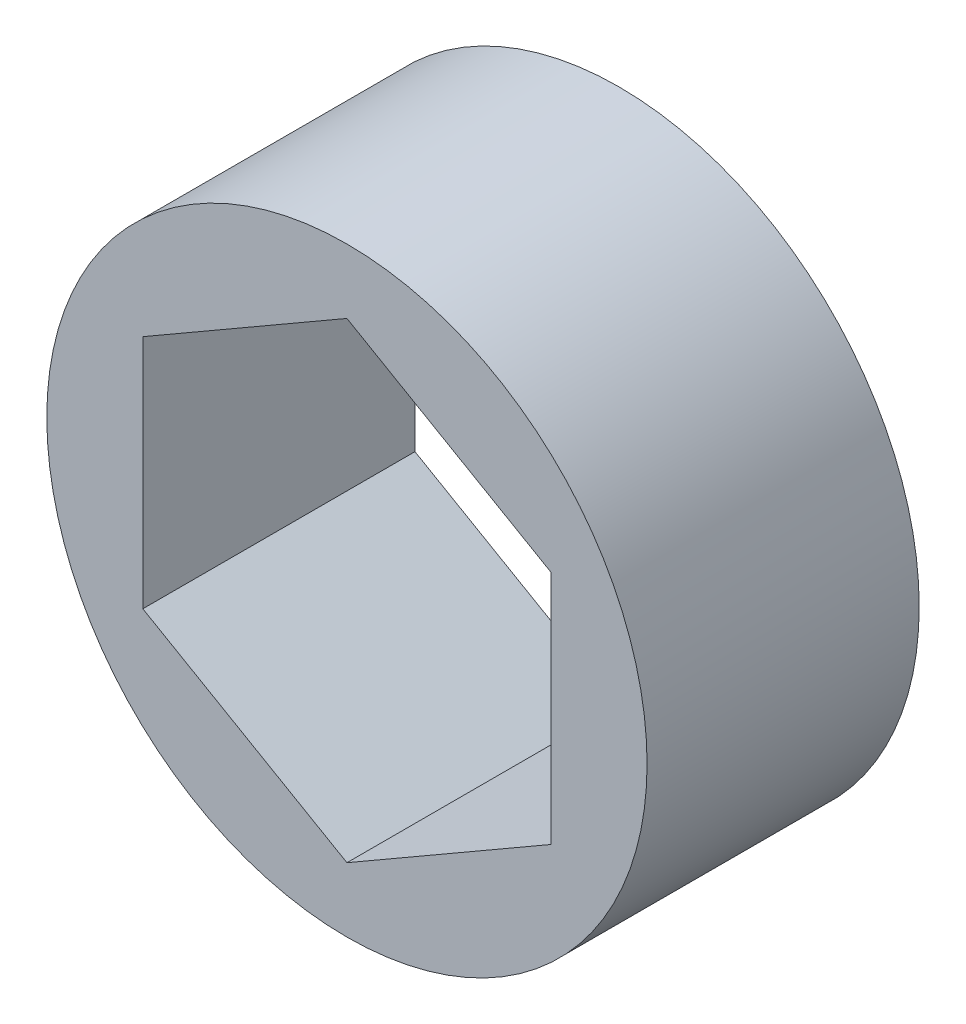
ISO-10303-21;
HEADER;
FILE_DESCRIPTION(('STEP AP214'),'2;1');
FILE_NAME('part.step','',(''),(''),'','','');
FILE_SCHEMA(('AUTOMOTIVE_DESIGN { 1 0 10303 214 1 1 1 1 }'));
ENDSEC;
DATA;
#1=APPLICATION_CONTEXT('core data for automotive mechanical design processes');
#2=APPLICATION_PROTOCOL_DEFINITION('international standard','automotive_design',2000,#1);
#3=PRODUCT_CONTEXT('',#1,'mechanical');
#4=PRODUCT('Part','Part','',(#3));
#5=PRODUCT_RELATED_PRODUCT_CATEGORY('part','',(#4));
#6=PRODUCT_DEFINITION_FORMATION('','',#4);
#7=PRODUCT_DEFINITION_CONTEXT('part definition',#1,'design');
#8=PRODUCT_DEFINITION('design','',#6,#7);
#9=PRODUCT_DEFINITION_SHAPE('','',#8);
#10=(LENGTH_UNIT() NAMED_UNIT(*) SI_UNIT(.MILLI.,.METRE.));
#11=(NAMED_UNIT(*) PLANE_ANGLE_UNIT() SI_UNIT($,.RADIAN.));
#12=(NAMED_UNIT(*) SI_UNIT($,.STERADIAN.) SOLID_ANGLE_UNIT());
#13=UNCERTAINTY_MEASURE_WITH_UNIT(LENGTH_MEASURE(1.E-05),#10,'distance_accuracy_value','');
#14=(GEOMETRIC_REPRESENTATION_CONTEXT(3) GLOBAL_UNCERTAINTY_ASSIGNED_CONTEXT((#13)) GLOBAL_UNIT_ASSIGNED_CONTEXT((#10,
#11,#12)) REPRESENTATION_CONTEXT('',''));
#15=CARTESIAN_POINT('',(0.,0.,0.));
#16=DIRECTION('',(0.,0.,1.));
#17=DIRECTION('',(1.,0.,0.));
#18=AXIS2_PLACEMENT_3D('',#15,#16,#17);
#19=CARTESIAN_POINT('',(0.,0.,4.318));
#20=DIRECTION('',(0.,0.,1.));
#21=DIRECTION('',(1.,0.,0.));
#22=AXIS2_PLACEMENT_3D('',#19,#20,#21);
#23=PLANE('',#22);
#24=CARTESIAN_POINT('',(0.,0.,4.318));
#25=DIRECTION('',(0.,0.,1.));
#26=DIRECTION('',(1.,0.,0.));
#27=AXIS2_PLACEMENT_3D('',#24,#25,#26);
#28=CIRCLE('',#27,9.525);
#29=CARTESIAN_POINT('',(9.525,0.,4.318));
#30=VERTEX_POINT('',#29);
#31=EDGE_CURVE('E11',#30,#30,#28,.T.);
#32=ORIENTED_EDGE('',*,*,#31,.T.);
#33=EDGE_LOOP('',(#32));
#34=FACE_BOUND('',#33,.T.);
#35=DIRECTION('',(-0.866025403784439,-0.5,0.));
#36=VECTOR('',#35,1.);
#37=CARTESIAN_POINT('',(0.,7.47899538708241,4.318));
#38=LINE('',#37,#36);
#39=CARTESIAN_POINT('',(0.,7.47899538708241,4.318));
#40=VERTEX_POINT('',#39);
#41=CARTESIAN_POINT('',(-6.477,3.73949769354121,4.318));
#42=VERTEX_POINT('',#41);
#43=EDGE_CURVE('E108',#40,#42,#38,.T.);
#44=ORIENTED_EDGE('',*,*,#43,.F.);
#45=DIRECTION('',(-0.866025403784439,0.5,0.));
#46=VECTOR('',#45,1.);
#47=CARTESIAN_POINT('',(6.477,3.73949769354121,4.318));
#48=LINE('',#47,#46);
#49=CARTESIAN_POINT('',(6.477,3.73949769354121,4.318));
#50=VERTEX_POINT('',#49);
#51=EDGE_CURVE('E99',#50,#40,#48,.T.);
#52=ORIENTED_EDGE('',*,*,#51,.F.);
#53=DIRECTION('',(0.,1.,0.));
#54=VECTOR('',#53,1.);
#55=CARTESIAN_POINT('',(6.477,-3.73949769354121,4.318));
#56=LINE('',#55,#54);
#57=CARTESIAN_POINT('',(6.477,-3.73949769354121,4.318));
#58=VERTEX_POINT('',#57);
#59=EDGE_CURVE('E133',#58,#50,#56,.T.);
#60=ORIENTED_EDGE('',*,*,#59,.F.);
#61=DIRECTION('',(0.866025403784439,0.5,0.));
#62=VECTOR('',#61,1.);
#63=CARTESIAN_POINT('',(0.,-7.47899538708241,4.318));
#64=LINE('',#63,#62);
#65=CARTESIAN_POINT('',(0.,-7.47899538708241,4.318));
#66=VERTEX_POINT('',#65);
#67=EDGE_CURVE('E130',#66,#58,#64,.T.);
#68=ORIENTED_EDGE('',*,*,#67,.F.);
#69=DIRECTION('',(0.866025403784438,-0.5,0.));
#70=VECTOR('',#69,1.);
#71=CARTESIAN_POINT('',(-6.477,-3.73949769354121,4.318));
#72=LINE('',#71,#70);
#73=CARTESIAN_POINT('',(-6.477,-3.73949769354121,4.318));
#74=VERTEX_POINT('',#73);
#75=EDGE_CURVE('E125',#74,#66,#72,.T.);
#76=ORIENTED_EDGE('',*,*,#75,.F.);
#77=DIRECTION('',(0.,-1.,0.));
#78=VECTOR('',#77,1.);
#79=CARTESIAN_POINT('',(-6.477,3.73949769354121,4.318));
#80=LINE('',#79,#78);
#81=EDGE_CURVE('E121',#42,#74,#80,.T.);
#82=ORIENTED_EDGE('',*,*,#81,.F.);
#83=EDGE_LOOP('',(#44,#52,#60,#68,#76,#82));
#84=FACE_BOUND('',#83,.T.);
#85=ADVANCED_FACE('F45',(#34,#84),#23,.T.);
#86=CARTESIAN_POINT('',(0.,0.,-4.318));
#87=DIRECTION('',(0.,0.,1.));
#88=DIRECTION('',(1.,0.,0.));
#89=AXIS2_PLACEMENT_3D('',#86,#87,#88);
#90=PLANE('',#89);
#91=CARTESIAN_POINT('',(0.,0.,-4.318));
#92=DIRECTION('',(0.,0.,1.));
#93=DIRECTION('',(1.,0.,0.));
#94=AXIS2_PLACEMENT_3D('',#91,#92,#93);
#95=CIRCLE('',#94,9.525);
#96=CARTESIAN_POINT('',(9.525,0.,-4.318));
#97=VERTEX_POINT('',#96);
#98=EDGE_CURVE('E49',#97,#97,#95,.T.);
#99=ORIENTED_EDGE('',*,*,#98,.F.);
#100=EDGE_LOOP('',(#99));
#101=FACE_BOUND('',#100,.T.);
#102=DIRECTION('',(-0.866025403784439,0.5,0.));
#103=VECTOR('',#102,1.);
#104=CARTESIAN_POINT('',(6.477,3.73949769354121,-4.318));
#105=LINE('',#104,#103);
#106=CARTESIAN_POINT('',(6.477,3.73949769354121,-4.318));
#107=VERTEX_POINT('',#106);
#108=CARTESIAN_POINT('',(0.,7.47899538708241,-4.318));
#109=VERTEX_POINT('',#108);
#110=EDGE_CURVE('E69',#107,#109,#105,.T.);
#111=ORIENTED_EDGE('',*,*,#110,.T.);
#112=DIRECTION('',(-0.866025403784439,-0.5,0.));
#113=VECTOR('',#112,1.);
#114=CARTESIAN_POINT('',(0.,7.47899538708241,-4.318));
#115=LINE('',#114,#113);
#116=CARTESIAN_POINT('',(-6.477,3.73949769354121,-4.318));
#117=VERTEX_POINT('',#116);
#118=EDGE_CURVE('E115',#109,#117,#115,.T.);
#119=ORIENTED_EDGE('',*,*,#118,.T.);
#120=DIRECTION('',(0.,-1.,0.));
#121=VECTOR('',#120,1.);
#122=CARTESIAN_POINT('',(-6.477,3.73949769354121,-4.318));
#123=LINE('',#122,#121);
#124=CARTESIAN_POINT('',(-6.477,-3.73949769354121,-4.318));
#125=VERTEX_POINT('',#124);
#126=EDGE_CURVE('E140',#117,#125,#123,.T.);
#127=ORIENTED_EDGE('',*,*,#126,.T.);
#128=DIRECTION('',(0.866025403784438,-0.5,0.));
#129=VECTOR('',#128,1.);
#130=CARTESIAN_POINT('',(-6.477,-3.73949769354121,-4.318));
#131=LINE('',#130,#129);
#132=CARTESIAN_POINT('',(0.,-7.47899538708241,-4.318));
#133=VERTEX_POINT('',#132);
#134=EDGE_CURVE('E144',#125,#133,#131,.T.);
#135=ORIENTED_EDGE('',*,*,#134,.T.);
#136=DIRECTION('',(0.866025403784439,0.5,0.));
#137=VECTOR('',#136,1.);
#138=CARTESIAN_POINT('',(0.,-7.47899538708241,-4.318));
#139=LINE('',#138,#137);
#140=CARTESIAN_POINT('',(6.477,-3.73949769354121,-4.318));
#141=VERTEX_POINT('',#140);
#142=EDGE_CURVE('E148',#133,#141,#139,.T.);
#143=ORIENTED_EDGE('',*,*,#142,.T.);
#144=DIRECTION('',(0.,1.,0.));
#145=VECTOR('',#144,1.);
#146=CARTESIAN_POINT('',(6.477,-3.73949769354121,-4.318));
#147=LINE('',#146,#145);
#148=EDGE_CURVE('E109',#141,#107,#147,.T.);
#149=ORIENTED_EDGE('',*,*,#148,.T.);
#150=EDGE_LOOP('',(#111,#119,#127,#135,#143,#149));
#151=FACE_BOUND('',#150,.T.);
#152=ADVANCED_FACE('F172',(#101,#151),#90,.F.);
#153=CARTESIAN_POINT('',(0.,0.,4.318));
#154=DIRECTION('',(0.,0.,-1.));
#155=DIRECTION('',(-1.,0.,0.));
#156=AXIS2_PLACEMENT_3D('',#153,#154,#155);
#157=CYLINDRICAL_SURFACE('',#156,9.525);
#158=ORIENTED_EDGE('',*,*,#31,.F.);
#159=EDGE_LOOP('',(#158));
#160=FACE_BOUND('',#159,.T.);
#161=ORIENTED_EDGE('',*,*,#98,.T.);
#162=EDGE_LOOP('',(#161));
#163=FACE_BOUND('',#162,.T.);
#164=ADVANCED_FACE('F47',(#160,#163),#157,.T.);
#165=CARTESIAN_POINT('',(6.477,3.73949769354121,4.318));
#166=DIRECTION('',(-0.5,-0.866025403784439,0.));
#167=DIRECTION('',(0.866025403784439,-0.5,0.));
#168=AXIS2_PLACEMENT_3D('',#165,#166,#167);
#169=PLANE('',#168);
#170=ORIENTED_EDGE('',*,*,#110,.F.);
#171=DIRECTION('',(0.,0.,-1.));
#172=VECTOR('',#171,1.);
#173=CARTESIAN_POINT('',(6.477,3.73949769354121,4.318));
#174=LINE('',#173,#172);
#175=EDGE_CURVE('E103',#50,#107,#174,.T.);
#176=ORIENTED_EDGE('',*,*,#175,.F.);
#177=ORIENTED_EDGE('',*,*,#51,.T.);
#178=DIRECTION('',(0.,0.,-1.));
#179=VECTOR('',#178,1.);
#180=CARTESIAN_POINT('',(0.,7.47899538708241,4.318));
#181=LINE('',#180,#179);
#182=EDGE_CURVE('E102',#40,#109,#181,.T.);
#183=ORIENTED_EDGE('',*,*,#182,.T.);
#184=EDGE_LOOP('',(#170,#176,#177,#183));
#185=FACE_BOUND('',#184,.T.);
#186=ADVANCED_FACE('F101',(#185),#169,.T.);
#187=CARTESIAN_POINT('',(0.,7.47899538708241,4.318));
#188=DIRECTION('',(0.5,-0.866025403784439,0.));
#189=DIRECTION('',(0.866025403784439,0.5,0.));
#190=AXIS2_PLACEMENT_3D('',#187,#188,#189);
#191=PLANE('',#190);
#192=ORIENTED_EDGE('',*,*,#118,.F.);
#193=ORIENTED_EDGE('',*,*,#182,.F.);
#194=ORIENTED_EDGE('',*,*,#43,.T.);
#195=DIRECTION('',(0.,0.,-1.));
#196=VECTOR('',#195,1.);
#197=CARTESIAN_POINT('',(-6.477,3.73949769354121,4.318));
#198=LINE('',#197,#196);
#199=EDGE_CURVE('E117',#42,#117,#198,.T.);
#200=ORIENTED_EDGE('',*,*,#199,.T.);
#201=EDGE_LOOP('',(#192,#193,#194,#200));
#202=FACE_BOUND('',#201,.T.);
#203=ADVANCED_FACE('F112',(#202),#191,.T.);
#204=CARTESIAN_POINT('',(-6.477,3.73949769354121,4.318));
#205=DIRECTION('',(1.,0.,0.));
#206=DIRECTION('',(0.,0.,-1.));
#207=AXIS2_PLACEMENT_3D('',#204,#205,#206);
#208=PLANE('',#207);
#209=ORIENTED_EDGE('',*,*,#126,.F.);
#210=ORIENTED_EDGE('',*,*,#199,.F.);
#211=ORIENTED_EDGE('',*,*,#81,.T.);
#212=DIRECTION('',(0.,0.,-1.));
#213=VECTOR('',#212,1.);
#214=CARTESIAN_POINT('',(-6.477,-3.73949769354121,4.318));
#215=LINE('',#214,#213);
#216=EDGE_CURVE('E162',#74,#125,#215,.T.);
#217=ORIENTED_EDGE('',*,*,#216,.T.);
#218=EDGE_LOOP('',(#209,#210,#211,#217));
#219=FACE_BOUND('',#218,.T.);
#220=ADVANCED_FACE('F168',(#219),#208,.T.);
#221=CARTESIAN_POINT('',(-6.477,-3.73949769354121,4.318));
#222=DIRECTION('',(0.5,0.866025403784438,0.));
#223=DIRECTION('',(-0.866025403784439,0.5,0.));
#224=AXIS2_PLACEMENT_3D('',#221,#222,#223);
#225=PLANE('',#224);
#226=ORIENTED_EDGE('',*,*,#134,.F.);
#227=ORIENTED_EDGE('',*,*,#216,.F.);
#228=ORIENTED_EDGE('',*,*,#75,.T.);
#229=DIRECTION('',(0.,0.,-1.));
#230=VECTOR('',#229,1.);
#231=CARTESIAN_POINT('',(0.,-7.47899538708241,4.318));
#232=LINE('',#231,#230);
#233=EDGE_CURVE('E159',#66,#133,#232,.T.);
#234=ORIENTED_EDGE('',*,*,#233,.T.);
#235=EDGE_LOOP('',(#226,#227,#228,#234));
#236=FACE_BOUND('',#235,.T.);
#237=ADVANCED_FACE('F180',(#236),#225,.T.);
#238=CARTESIAN_POINT('',(0.,-7.47899538708241,4.318));
#239=DIRECTION('',(-0.5,0.866025403784439,0.));
#240=DIRECTION('',(-0.866025403784439,-0.5,0.));
#241=AXIS2_PLACEMENT_3D('',#238,#239,#240);
#242=PLANE('',#241);
#243=ORIENTED_EDGE('',*,*,#142,.F.);
#244=ORIENTED_EDGE('',*,*,#233,.F.);
#245=ORIENTED_EDGE('',*,*,#67,.T.);
#246=DIRECTION('',(0.,0.,-1.));
#247=VECTOR('',#246,1.);
#248=CARTESIAN_POINT('',(6.477,-3.73949769354121,4.318));
#249=LINE('',#248,#247);
#250=EDGE_CURVE('E61',#58,#141,#249,.T.);
#251=ORIENTED_EDGE('',*,*,#250,.T.);
#252=EDGE_LOOP('',(#243,#244,#245,#251));
#253=FACE_BOUND('',#252,.T.);
#254=ADVANCED_FACE('F178',(#253),#242,.T.);
#255=CARTESIAN_POINT('',(6.477,-3.73949769354121,4.318));
#256=DIRECTION('',(-1.,0.,0.));
#257=DIRECTION('',(0.,-1.,0.));
#258=AXIS2_PLACEMENT_3D('',#255,#256,#257);
#259=PLANE('',#258);
#260=ORIENTED_EDGE('',*,*,#148,.F.);
#261=ORIENTED_EDGE('',*,*,#250,.F.);
#262=ORIENTED_EDGE('',*,*,#59,.T.);
#263=ORIENTED_EDGE('',*,*,#175,.T.);
#264=EDGE_LOOP('',(#260,#261,#262,#263));
#265=FACE_BOUND('',#264,.T.);
#266=ADVANCED_FACE('F174',(#265),#259,.T.);
#267=CLOSED_SHELL('',(#85,#152,#164,#186,#203,#220,#237,#254,#266));
#268=MANIFOLD_SOLID_BREP('B2',#267);
#269=ADVANCED_BREP_SHAPE_REPRESENTATION('',(#18,#268),#14);
#270=SHAPE_DEFINITION_REPRESENTATION(#9,#269);
ENDSEC;
END-ISO-10303-21;
